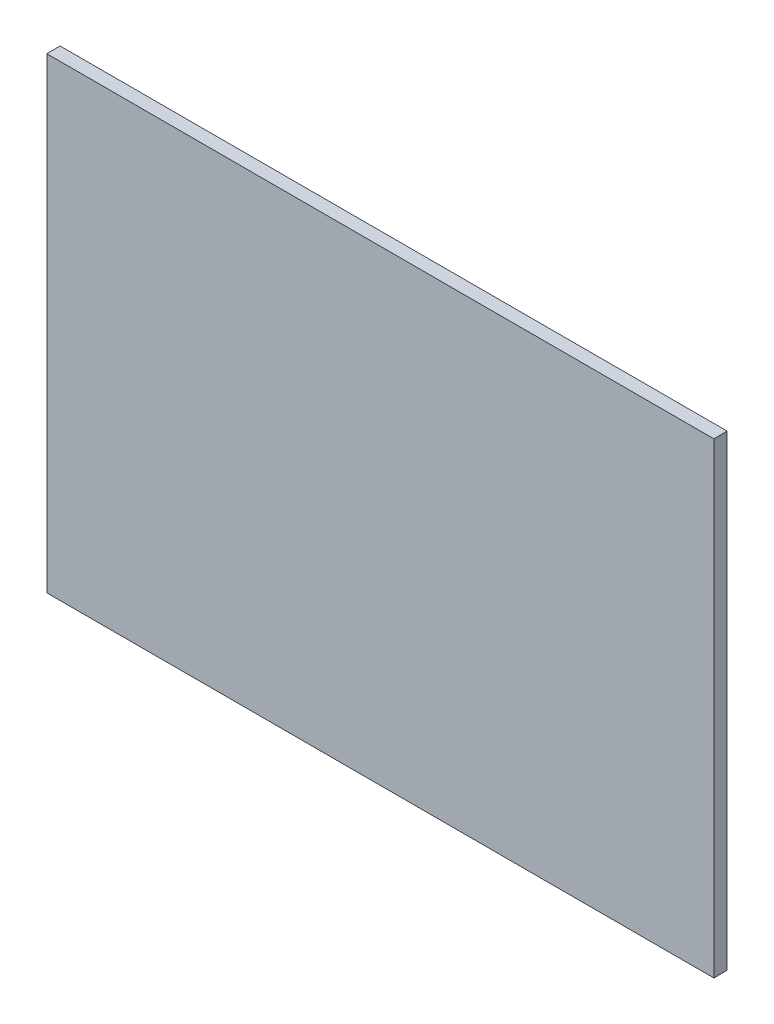
ISO-10303-21;
HEADER;
FILE_DESCRIPTION(('STEP AP214'),'2;1');
FILE_NAME('part.step','',(''),(''),'','','');
FILE_SCHEMA(('AUTOMOTIVE_DESIGN { 1 0 10303 214 1 1 1 1 }'));
ENDSEC;
DATA;
#1=APPLICATION_CONTEXT('core data for automotive mechanical design processes');
#2=APPLICATION_PROTOCOL_DEFINITION('international standard','automotive_design',2000,#1);
#3=PRODUCT_CONTEXT('',#1,'mechanical');
#4=PRODUCT('Part','Part','',(#3));
#5=PRODUCT_RELATED_PRODUCT_CATEGORY('part','',(#4));
#6=PRODUCT_DEFINITION_FORMATION('','',#4);
#7=PRODUCT_DEFINITION_CONTEXT('part definition',#1,'design');
#8=PRODUCT_DEFINITION('design','',#6,#7);
#9=PRODUCT_DEFINITION_SHAPE('','',#8);
#10=(LENGTH_UNIT() NAMED_UNIT(*) SI_UNIT(.MILLI.,.METRE.));
#11=(NAMED_UNIT(*) PLANE_ANGLE_UNIT() SI_UNIT($,.RADIAN.));
#12=(NAMED_UNIT(*) SI_UNIT($,.STERADIAN.) SOLID_ANGLE_UNIT());
#13=UNCERTAINTY_MEASURE_WITH_UNIT(LENGTH_MEASURE(1.E-05),#10,'distance_accuracy_value','');
#14=(GEOMETRIC_REPRESENTATION_CONTEXT(3) GLOBAL_UNCERTAINTY_ASSIGNED_CONTEXT((#13)) GLOBAL_UNIT_ASSIGNED_CONTEXT((#10,
#11,#12)) REPRESENTATION_CONTEXT('',''));
#15=CARTESIAN_POINT('',(0.,0.,0.));
#16=DIRECTION('',(0.,0.,1.));
#17=DIRECTION('',(1.,0.,0.));
#18=AXIS2_PLACEMENT_3D('',#15,#16,#17);
#19=CARTESIAN_POINT('',(-2500.,-1750.,100.));
#20=DIRECTION('',(1.,0.,0.));
#21=DIRECTION('',(0.,0.,-1.));
#22=AXIS2_PLACEMENT_3D('',#19,#20,#21);
#23=PLANE('',#22);
#24=DIRECTION('',(0.,-1.,0.));
#25=VECTOR('',#24,1.);
#26=CARTESIAN_POINT('',(-2500.,-1750.,0.));
#27=LINE('',#26,#25);
#28=CARTESIAN_POINT('',(-2500.,1750.,0.));
#29=VERTEX_POINT('',#28);
#30=CARTESIAN_POINT('',(-2500.,-1750.,0.));
#31=VERTEX_POINT('',#30);
#32=EDGE_CURVE('E111',#29,#31,#27,.T.);
#33=ORIENTED_EDGE('',*,*,#32,.T.);
#34=DIRECTION('',(0.,0.,-1.));
#35=VECTOR('',#34,1.);
#36=CARTESIAN_POINT('',(-2500.,-1750.,100.));
#37=LINE('',#36,#35);
#38=CARTESIAN_POINT('',(-2500.,-1750.,100.));
#39=VERTEX_POINT('',#38);
#40=EDGE_CURVE('E11',#39,#31,#37,.T.);
#41=ORIENTED_EDGE('',*,*,#40,.F.);
#42=DIRECTION('',(0.,-1.,0.));
#43=VECTOR('',#42,1.);
#44=CARTESIAN_POINT('',(-2500.,-1750.,100.));
#45=LINE('',#44,#43);
#46=CARTESIAN_POINT('',(-2500.,1750.,100.));
#47=VERTEX_POINT('',#46);
#48=EDGE_CURVE('E95',#47,#39,#45,.T.);
#49=ORIENTED_EDGE('',*,*,#48,.F.);
#50=DIRECTION('',(0.,0.,-1.));
#51=VECTOR('',#50,1.);
#52=CARTESIAN_POINT('',(-2500.,1750.,100.));
#53=LINE('',#52,#51);
#54=EDGE_CURVE('E107',#47,#29,#53,.T.);
#55=ORIENTED_EDGE('',*,*,#54,.T.);
#56=EDGE_LOOP('',(#33,#41,#49,#55));
#57=FACE_BOUND('',#56,.T.);
#58=ADVANCED_FACE('F43',(#57),#23,.F.);
#59=CARTESIAN_POINT('',(2500.,-1750.,100.));
#60=DIRECTION('',(0.,1.,0.));
#61=DIRECTION('',(-1.,0.,0.));
#62=AXIS2_PLACEMENT_3D('',#59,#60,#61);
#63=PLANE('',#62);
#64=DIRECTION('',(1.,0.,0.));
#65=VECTOR('',#64,1.);
#66=CARTESIAN_POINT('',(2500.,-1750.,0.));
#67=LINE('',#66,#65);
#68=CARTESIAN_POINT('',(2500.,-1750.,0.));
#69=VERTEX_POINT('',#68);
#70=EDGE_CURVE('E100',#31,#69,#67,.T.);
#71=ORIENTED_EDGE('',*,*,#70,.T.);
#72=DIRECTION('',(0.,0.,-1.));
#73=VECTOR('',#72,1.);
#74=CARTESIAN_POINT('',(2500.,-1750.,100.));
#75=LINE('',#74,#73);
#76=CARTESIAN_POINT('',(2500.,-1750.,100.));
#77=VERTEX_POINT('',#76);
#78=EDGE_CURVE('E52',#77,#69,#75,.T.);
#79=ORIENTED_EDGE('',*,*,#78,.F.);
#80=DIRECTION('',(1.,0.,0.));
#81=VECTOR('',#80,1.);
#82=CARTESIAN_POINT('',(2500.,-1750.,100.));
#83=LINE('',#82,#81);
#84=EDGE_CURVE('E90',#39,#77,#83,.T.);
#85=ORIENTED_EDGE('',*,*,#84,.F.);
#86=ORIENTED_EDGE('',*,*,#40,.T.);
#87=EDGE_LOOP('',(#71,#79,#85,#86));
#88=FACE_BOUND('',#87,.T.);
#89=ADVANCED_FACE('F99',(#88),#63,.F.);
#90=CARTESIAN_POINT('',(2500.,-1750.,100.));
#91=DIRECTION('',(-1.,0.,0.));
#92=DIRECTION('',(0.,0.,1.));
#93=AXIS2_PLACEMENT_3D('',#90,#91,#92);
#94=PLANE('',#93);
#95=DIRECTION('',(0.,1.,0.));
#96=VECTOR('',#95,1.);
#97=CARTESIAN_POINT('',(2500.,-1750.,0.));
#98=LINE('',#97,#96);
#99=CARTESIAN_POINT('',(2500.,1750.,0.));
#100=VERTEX_POINT('',#99);
#101=EDGE_CURVE('E77',#69,#100,#98,.T.);
#102=ORIENTED_EDGE('',*,*,#101,.T.);
#103=DIRECTION('',(0.,0.,-1.));
#104=VECTOR('',#103,1.);
#105=CARTESIAN_POINT('',(2500.,1750.,100.));
#106=LINE('',#105,#104);
#107=CARTESIAN_POINT('',(2500.,1750.,100.));
#108=VERTEX_POINT('',#107);
#109=EDGE_CURVE('E102',#108,#100,#106,.T.);
#110=ORIENTED_EDGE('',*,*,#109,.F.);
#111=DIRECTION('',(0.,1.,0.));
#112=VECTOR('',#111,1.);
#113=CARTESIAN_POINT('',(2500.,-1750.,100.));
#114=LINE('',#113,#112);
#115=EDGE_CURVE('E93',#77,#108,#114,.T.);
#116=ORIENTED_EDGE('',*,*,#115,.F.);
#117=ORIENTED_EDGE('',*,*,#78,.T.);
#118=EDGE_LOOP('',(#102,#110,#116,#117));
#119=FACE_BOUND('',#118,.T.);
#120=ADVANCED_FACE('F103',(#119),#94,.F.);
#121=CARTESIAN_POINT('',(2500.,1750.,100.));
#122=DIRECTION('',(0.,-1.,0.));
#123=DIRECTION('',(1.,0.,0.));
#124=AXIS2_PLACEMENT_3D('',#121,#122,#123);
#125=PLANE('',#124);
#126=DIRECTION('',(-1.,0.,0.));
#127=VECTOR('',#126,1.);
#128=CARTESIAN_POINT('',(2500.,1750.,0.));
#129=LINE('',#128,#127);
#130=EDGE_CURVE('E83',#100,#29,#129,.T.);
#131=ORIENTED_EDGE('',*,*,#130,.T.);
#132=ORIENTED_EDGE('',*,*,#54,.F.);
#133=DIRECTION('',(-1.,0.,0.));
#134=VECTOR('',#133,1.);
#135=CARTESIAN_POINT('',(2500.,1750.,100.));
#136=LINE('',#135,#134);
#137=EDGE_CURVE('E60',#108,#47,#136,.T.);
#138=ORIENTED_EDGE('',*,*,#137,.F.);
#139=ORIENTED_EDGE('',*,*,#109,.T.);
#140=EDGE_LOOP('',(#131,#132,#138,#139));
#141=FACE_BOUND('',#140,.T.);
#142=ADVANCED_FACE('F124',(#141),#125,.F.);
#143=CARTESIAN_POINT('',(0.,0.,100.));
#144=DIRECTION('',(0.,0.,1.));
#145=DIRECTION('',(1.,0.,0.));
#146=AXIS2_PLACEMENT_3D('',#143,#144,#145);
#147=PLANE('',#146);
#148=ORIENTED_EDGE('',*,*,#48,.T.);
#149=ORIENTED_EDGE('',*,*,#84,.T.);
#150=ORIENTED_EDGE('',*,*,#115,.T.);
#151=ORIENTED_EDGE('',*,*,#137,.T.);
#152=EDGE_LOOP('',(#148,#149,#150,#151));
#153=FACE_BOUND('',#152,.T.);
#154=ADVANCED_FACE('F91',(#153),#147,.T.);
#155=CARTESIAN_POINT('',(0.,0.,0.));
#156=DIRECTION('',(0.,0.,1.));
#157=DIRECTION('',(1.,0.,0.));
#158=AXIS2_PLACEMENT_3D('',#155,#156,#157);
#159=PLANE('',#158);
#160=ORIENTED_EDGE('',*,*,#32,.F.);
#161=ORIENTED_EDGE('',*,*,#130,.F.);
#162=ORIENTED_EDGE('',*,*,#101,.F.);
#163=ORIENTED_EDGE('',*,*,#70,.F.);
#164=EDGE_LOOP('',(#160,#161,#162,#163));
#165=FACE_BOUND('',#164,.T.);
#166=ADVANCED_FACE('F127',(#165),#159,.F.);
#167=CLOSED_SHELL('',(#58,#89,#120,#142,#154,#166));
#168=MANIFOLD_SOLID_BREP('B2',#167);
#169=ADVANCED_BREP_SHAPE_REPRESENTATION('',(#18,#168),#14);
#170=SHAPE_DEFINITION_REPRESENTATION(#9,#169);
ENDSEC;
END-ISO-10303-21;
